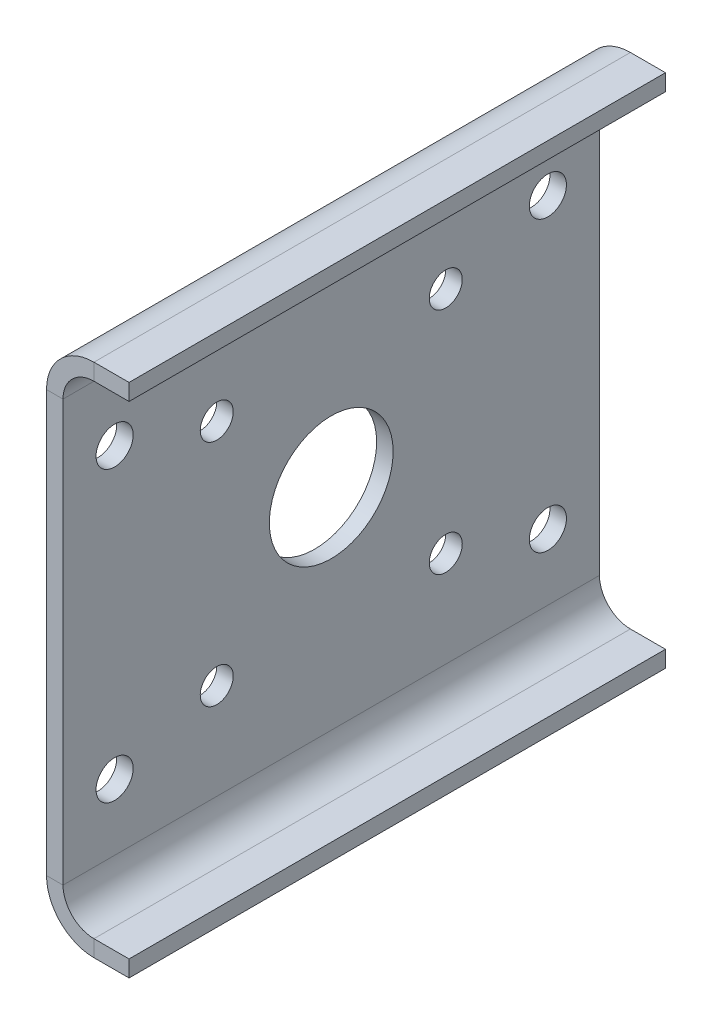
ISO-10303-21;
HEADER;
FILE_DESCRIPTION(('STEP AP214'),'2;1');
FILE_NAME('part.step','',(''),(''),'','','');
FILE_SCHEMA(('AUTOMOTIVE_DESIGN { 1 0 10303 214 1 1 1 1 }'));
ENDSEC;
DATA;
#1=APPLICATION_CONTEXT('core data for automotive mechanical design processes');
#2=APPLICATION_PROTOCOL_DEFINITION('international standard','automotive_design',2000,#1);
#3=PRODUCT_CONTEXT('',#1,'mechanical');
#4=PRODUCT('Part','Part','',(#3));
#5=PRODUCT_RELATED_PRODUCT_CATEGORY('part','',(#4));
#6=PRODUCT_DEFINITION_FORMATION('','',#4);
#7=PRODUCT_DEFINITION_CONTEXT('part definition',#1,'design');
#8=PRODUCT_DEFINITION('design','',#6,#7);
#9=PRODUCT_DEFINITION_SHAPE('','',#8);
#10=(LENGTH_UNIT() NAMED_UNIT(*) SI_UNIT(.MILLI.,.METRE.));
#11=(NAMED_UNIT(*) PLANE_ANGLE_UNIT() SI_UNIT($,.RADIAN.));
#12=(NAMED_UNIT(*) SI_UNIT($,.STERADIAN.) SOLID_ANGLE_UNIT());
#13=UNCERTAINTY_MEASURE_WITH_UNIT(LENGTH_MEASURE(1.E-05),#10,'distance_accuracy_value','');
#14=(GEOMETRIC_REPRESENTATION_CONTEXT(3) GLOBAL_UNCERTAINTY_ASSIGNED_CONTEXT((#13)) GLOBAL_UNIT_ASSIGNED_CONTEXT((#10,
#11,#12)) REPRESENTATION_CONTEXT('',''));
#15=CARTESIAN_POINT('',(0.,0.,0.));
#16=DIRECTION('',(0.,0.,1.));
#17=DIRECTION('',(1.,0.,0.));
#18=AXIS2_PLACEMENT_3D('',#15,#16,#17);
#19=CARTESIAN_POINT('',(-8.00000000000001,0.,0.));
#20=DIRECTION('',(1.00000000000001,0.,0.));
#21=DIRECTION('',(0.,0.,-1.));
#22=AXIS2_PLACEMENT_3D('',#19,#20,#21);
#23=PLANE('',#22);
#24=CARTESIAN_POINT('',(-7.99999999999756,-55.5,-55.4999999999999));
#25=DIRECTION('',(-1.00000000000001,0.,0.));
#26=DIRECTION('',(0.,0.,-1.));
#27=AXIS2_PLACEMENT_3D('',#24,#25,#26);
#28=CIRCLE('',#27,7.99999999999999);
#29=CARTESIAN_POINT('',(-7.99999999999756,-55.5,-63.4999999999999));
#30=VERTEX_POINT('',#29);
#31=EDGE_CURVE('E310',#30,#30,#28,.T.);
#32=ORIENTED_EDGE('',*,*,#31,.F.);
#33=EDGE_LOOP('',(#32));
#34=FACE_BOUND('',#33,.T.);
#35=CARTESIAN_POINT('',(-8.00000000000001,55.5000000000017,-55.4999999999994));
#36=DIRECTION('',(-1.00000000000001,0.,0.));
#37=DIRECTION('',(0.,1.00000000000001,0.));
#38=AXIS2_PLACEMENT_3D('',#35,#36,#37);
#39=CIRCLE('',#38,7.99999999999999);
#40=CARTESIAN_POINT('',(-8.00000000000002,63.5000000000018,-55.4999999999993));
#41=VERTEX_POINT('',#40);
#42=EDGE_CURVE('E315',#41,#41,#39,.T.);
#43=ORIENTED_EDGE('',*,*,#42,.F.);
#44=EDGE_LOOP('',(#43));
#45=FACE_BOUND('',#44,.T.);
#46=CARTESIAN_POINT('',(-7.99999999999756,-55.5000000000002,55.4999999999998));
#47=DIRECTION('',(-1.00000000000001,0.,0.));
#48=DIRECTION('',(0.,-1.00000000000001,0.));
#49=AXIS2_PLACEMENT_3D('',#46,#47,#48);
#50=CIRCLE('',#49,7.99999999999999);
#51=CARTESIAN_POINT('',(-7.99999999999756,-63.5000000000002,55.4999999999998));
#52=VERTEX_POINT('',#51);
#53=EDGE_CURVE('E307',#52,#52,#50,.T.);
#54=ORIENTED_EDGE('',*,*,#53,.F.);
#55=EDGE_LOOP('',(#54));
#56=FACE_BOUND('',#55,.T.);
#57=CARTESIAN_POINT('',(-8.00000000000001,55.5000000000012,55.4999999999999));
#58=DIRECTION('',(-1.00000000000001,0.,0.));
#59=DIRECTION('',(0.,0.,1.));
#60=AXIS2_PLACEMENT_3D('',#57,#58,#59);
#61=CIRCLE('',#60,7.99999999999999);
#62=CARTESIAN_POINT('',(-8.00000000000001,55.5000000000012,63.4999999999999));
#63=VERTEX_POINT('',#62);
#64=EDGE_CURVE('E304',#63,#63,#61,.T.);
#65=ORIENTED_EDGE('',*,*,#64,.F.);
#66=EDGE_LOOP('',(#65));
#67=FACE_BOUND('',#66,.T.);
#68=CARTESIAN_POINT('',(-7.99999999999756,70.0000000000012,-104.999999999995));
#69=DIRECTION('',(1.00000000000001,0.,0.));
#70=DIRECTION('',(0.,0.,-1.));
#71=AXIS2_PLACEMENT_3D('',#68,#69,#70);
#72=CIRCLE('',#71,8.99999999998515);
#73=CARTESIAN_POINT('',(-7.99999999999756,70.0000000000012,-113.999999999981));
#74=VERTEX_POINT('',#73);
#75=EDGE_CURVE('E328',#74,#74,#72,.F.);
#76=ORIENTED_EDGE('',*,*,#75,.F.);
#77=EDGE_LOOP('',(#76));
#78=FACE_BOUND('',#77,.T.);
#79=CARTESIAN_POINT('',(-8.00000000000001,-70.,-104.999999999996));
#80=DIRECTION('',(1.00000000000001,0.,0.));
#81=DIRECTION('',(0.,0.,-1.));
#82=AXIS2_PLACEMENT_3D('',#79,#80,#81);
#83=CIRCLE('',#82,8.99999999999579);
#84=CARTESIAN_POINT('',(-8.00000000000001,-70.,-113.999999999991));
#85=VERTEX_POINT('',#84);
#86=EDGE_CURVE('E334',#85,#85,#83,.F.);
#87=ORIENTED_EDGE('',*,*,#86,.F.);
#88=EDGE_LOOP('',(#87));
#89=FACE_BOUND('',#88,.T.);
#90=CARTESIAN_POINT('',(-7.99999999999756,70.0000000000012,104.999999999996));
#91=DIRECTION('',(1.00000000000001,0.,0.));
#92=DIRECTION('',(0.,0.,-1.));
#93=AXIS2_PLACEMENT_3D('',#90,#91,#92);
#94=CIRCLE('',#93,8.99999999998515);
#95=CARTESIAN_POINT('',(-7.99999999999756,70.0000000000012,96.0000000000108));
#96=VERTEX_POINT('',#95);
#97=EDGE_CURVE('E340',#96,#96,#94,.T.);
#98=ORIENTED_EDGE('',*,*,#97,.T.);
#99=EDGE_LOOP('',(#98));
#100=FACE_BOUND('',#99,.T.);
#101=CARTESIAN_POINT('',(-8.00000000000001,-70.,104.999999999996));
#102=DIRECTION('',(1.00000000000001,0.,0.));
#103=DIRECTION('',(0.,0.,-1.));
#104=AXIS2_PLACEMENT_3D('',#101,#102,#103);
#105=CIRCLE('',#104,8.99999999999579);
#106=CARTESIAN_POINT('',(-8.00000000000001,-70.,95.9999999999999));
#107=VERTEX_POINT('',#106);
#108=EDGE_CURVE('E213',#107,#107,#105,.T.);
#109=ORIENTED_EDGE('',*,*,#108,.T.);
#110=EDGE_LOOP('',(#109));
#111=FACE_BOUND('',#110,.T.);
#112=CARTESIAN_POINT('',(-8.00000000000001,0.,0.));
#113=DIRECTION('',(1.00000000000001,0.,0.));
#114=DIRECTION('',(0.,0.,-1.));
#115=AXIS2_PLACEMENT_3D('',#112,#113,#114);
#116=CIRCLE('',#115,30.);
#117=CARTESIAN_POINT('',(-8.00000000000001,0.,-30.));
#118=VERTEX_POINT('',#117);
#119=EDGE_CURVE('E291',#118,#118,#116,.T.);
#120=ORIENTED_EDGE('',*,*,#119,.T.);
#121=EDGE_LOOP('',(#120));
#122=FACE_BOUND('',#121,.T.);
#123=DIRECTION('',(0.,0.,-1.));
#124=VECTOR('',#123,1.);
#125=CARTESIAN_POINT('',(-8.00000000000001,-102.000000000001,-130.));
#126=LINE('',#125,#124);
#127=CARTESIAN_POINT('',(-8.00000000000001,-102.000000000001,-130.));
#128=VERTEX_POINT('',#127);
#129=CARTESIAN_POINT('',(-8.00000000000001,-102.000000000001,130.));
#130=VERTEX_POINT('',#129);
#131=EDGE_CURVE('E214',#128,#130,#126,.F.);
#132=ORIENTED_EDGE('',*,*,#131,.T.);
#133=DIRECTION('',(0.,-1.00000000000001,0.));
#134=VECTOR('',#133,1.);
#135=CARTESIAN_POINT('',(-8.00000000000001,-125.000000000001,130.));
#136=LINE('',#135,#134);
#137=CARTESIAN_POINT('',(-7.99999999999756,102.000000000002,130.));
#138=VERTEX_POINT('',#137);
#139=EDGE_CURVE('E87',#138,#130,#136,.T.);
#140=ORIENTED_EDGE('',*,*,#139,.F.);
#141=DIRECTION('',(0.,0.,1.));
#142=VECTOR('',#141,1.);
#143=CARTESIAN_POINT('',(-7.99999999999756,102.000000000002,130.));
#144=LINE('',#143,#142);
#145=CARTESIAN_POINT('',(-7.99999999999756,102.000000000002,-130.));
#146=VERTEX_POINT('',#145);
#147=EDGE_CURVE('E268',#138,#146,#144,.F.);
#148=ORIENTED_EDGE('',*,*,#147,.T.);
#149=DIRECTION('',(0.,1.00000000000001,0.));
#150=VECTOR('',#149,1.);
#151=CARTESIAN_POINT('',(-8.00000000000001,-125.000000000001,-130.));
#152=LINE('',#151,#150);
#153=EDGE_CURVE('E13',#128,#146,#152,.T.);
#154=ORIENTED_EDGE('',*,*,#153,.F.);
#155=EDGE_LOOP('',(#132,#140,#148,#154));
#156=FACE_BOUND('',#155,.T.);
#157=ADVANCED_FACE('F78',(#34,#45,#56,#67,#78,#89,#100,#111,#122,#156),#23,.F.);
#158=CARTESIAN_POINT('',(0.,0.,0.));
#159=DIRECTION('',(1.00000000000001,0.,0.));
#160=DIRECTION('',(0.,0.,-1.));
#161=AXIS2_PLACEMENT_3D('',#158,#159,#160);
#162=PLANE('',#161);
#163=CARTESIAN_POINT('',(2.44249065417534E-12,-55.5,-55.4999999999999));
#164=DIRECTION('',(1.00000000000001,0.,0.));
#165=DIRECTION('',(0.,0.,-1.));
#166=AXIS2_PLACEMENT_3D('',#163,#164,#165);
#167=CIRCLE('',#166,7.99999999999999);
#168=CARTESIAN_POINT('',(2.44249065417534E-12,-55.5,-63.4999999999999));
#169=VERTEX_POINT('',#168);
#170=EDGE_CURVE('E82',#169,#169,#167,.T.);
#171=ORIENTED_EDGE('',*,*,#170,.F.);
#172=EDGE_LOOP('',(#171));
#173=FACE_BOUND('',#172,.T.);
#174=CARTESIAN_POINT('',(0.,55.5000000000017,-55.4999999999994));
#175=DIRECTION('',(1.00000000000001,0.,0.));
#176=DIRECTION('',(0.,0.,-1.));
#177=AXIS2_PLACEMENT_3D('',#174,#175,#176);
#178=CIRCLE('',#177,7.99999999999999);
#179=CARTESIAN_POINT('',(0.,55.5000000000017,-63.4999999999994));
#180=VERTEX_POINT('',#179);
#181=EDGE_CURVE('E308',#180,#180,#178,.T.);
#182=ORIENTED_EDGE('',*,*,#181,.F.);
#183=EDGE_LOOP('',(#182));
#184=FACE_BOUND('',#183,.T.);
#185=CARTESIAN_POINT('',(2.44249065417534E-12,-55.5000000000002,55.4999999999998));
#186=DIRECTION('',(1.00000000000001,0.,0.));
#187=DIRECTION('',(0.,0.,-1.));
#188=AXIS2_PLACEMENT_3D('',#185,#186,#187);
#189=CIRCLE('',#188,7.99999999999999);
#190=CARTESIAN_POINT('',(2.44249065417534E-12,-55.5000000000002,47.4999999999998));
#191=VERTEX_POINT('',#190);
#192=EDGE_CURVE('E305',#191,#191,#189,.T.);
#193=ORIENTED_EDGE('',*,*,#192,.F.);
#194=EDGE_LOOP('',(#193));
#195=FACE_BOUND('',#194,.T.);
#196=CARTESIAN_POINT('',(0.,55.5000000000012,55.4999999999999));
#197=DIRECTION('',(1.00000000000001,0.,0.));
#198=DIRECTION('',(0.,0.,-1.));
#199=AXIS2_PLACEMENT_3D('',#196,#197,#198);
#200=CIRCLE('',#199,7.99999999999999);
#201=CARTESIAN_POINT('',(0.,55.5000000000012,47.5));
#202=VERTEX_POINT('',#201);
#203=EDGE_CURVE('E300',#202,#202,#200,.T.);
#204=ORIENTED_EDGE('',*,*,#203,.F.);
#205=EDGE_LOOP('',(#204));
#206=FACE_BOUND('',#205,.T.);
#207=CARTESIAN_POINT('',(2.44249065417534E-12,70.0000000000012,-104.999999999995));
#208=DIRECTION('',(-1.00000000000001,0.,0.));
#209=DIRECTION('',(0.,0.,1.));
#210=AXIS2_PLACEMENT_3D('',#207,#208,#209);
#211=CIRCLE('',#210,8.99999999998515);
#212=CARTESIAN_POINT('',(2.44249065417534E-12,70.0000000000012,-96.0000000000102));
#213=VERTEX_POINT('',#212);
#214=EDGE_CURVE('E303',#213,#213,#211,.T.);
#215=ORIENTED_EDGE('',*,*,#214,.T.);
#216=EDGE_LOOP('',(#215));
#217=FACE_BOUND('',#216,.T.);
#218=CARTESIAN_POINT('',(0.,-70.,-104.999999999996));
#219=DIRECTION('',(-1.00000000000001,0.,0.));
#220=DIRECTION('',(0.,0.,1.));
#221=AXIS2_PLACEMENT_3D('',#218,#219,#220);
#222=CIRCLE('',#221,8.99999999999579);
#223=CARTESIAN_POINT('',(0.,-70.,-95.9999999999999));
#224=VERTEX_POINT('',#223);
#225=EDGE_CURVE('E331',#224,#224,#222,.T.);
#226=ORIENTED_EDGE('',*,*,#225,.T.);
#227=EDGE_LOOP('',(#226));
#228=FACE_BOUND('',#227,.T.);
#229=CARTESIAN_POINT('',(2.44249065417534E-12,70.0000000000012,104.999999999996));
#230=DIRECTION('',(1.00000000000001,0.,0.));
#231=DIRECTION('',(0.,0.,-1.));
#232=AXIS2_PLACEMENT_3D('',#229,#230,#231);
#233=CIRCLE('',#232,8.99999999998515);
#234=CARTESIAN_POINT('',(2.44249065417534E-12,70.0000000000012,96.0000000000108));
#235=VERTEX_POINT('',#234);
#236=EDGE_CURVE('E337',#235,#235,#233,.T.);
#237=ORIENTED_EDGE('',*,*,#236,.F.);
#238=EDGE_LOOP('',(#237));
#239=FACE_BOUND('',#238,.T.);
#240=CARTESIAN_POINT('',(0.,-70.,104.999999999996));
#241=DIRECTION('',(1.00000000000001,0.,0.));
#242=DIRECTION('',(0.,0.,-1.));
#243=AXIS2_PLACEMENT_3D('',#240,#241,#242);
#244=CIRCLE('',#243,8.99999999999579);
#245=CARTESIAN_POINT('',(0.,-70.,95.9999999999999));
#246=VERTEX_POINT('',#245);
#247=EDGE_CURVE('E343',#246,#246,#244,.T.);
#248=ORIENTED_EDGE('',*,*,#247,.F.);
#249=EDGE_LOOP('',(#248));
#250=FACE_BOUND('',#249,.T.);
#251=CARTESIAN_POINT('',(0.,0.,0.));
#252=DIRECTION('',(1.00000000000001,0.,0.));
#253=DIRECTION('',(0.,0.,-1.));
#254=AXIS2_PLACEMENT_3D('',#251,#252,#253);
#255=CIRCLE('',#254,30.);
#256=CARTESIAN_POINT('',(0.,0.,-30.));
#257=VERTEX_POINT('',#256);
#258=EDGE_CURVE('E286',#257,#257,#255,.T.);
#259=ORIENTED_EDGE('',*,*,#258,.F.);
#260=EDGE_LOOP('',(#259));
#261=FACE_BOUND('',#260,.T.);
#262=DIRECTION('',(0.,-1.00000000000001,0.));
#263=VECTOR('',#262,1.);
#264=CARTESIAN_POINT('',(0.,-125.000000000001,130.));
#265=LINE('',#264,#263);
#266=CARTESIAN_POINT('',(2.44249065417534E-12,102.000000000001,130.));
#267=VERTEX_POINT('',#266);
#268=CARTESIAN_POINT('',(0.,-102.000000000001,130.));
#269=VERTEX_POINT('',#268);
#270=EDGE_CURVE('E294',#267,#269,#265,.T.);
#271=ORIENTED_EDGE('',*,*,#270,.T.);
#272=DIRECTION('',(0.,0.,-1.));
#273=VECTOR('',#272,1.);
#274=CARTESIAN_POINT('',(0.,-102.000000000001,-130.));
#275=LINE('',#274,#273);
#276=CARTESIAN_POINT('',(0.,-102.000000000001,-130.));
#277=VERTEX_POINT('',#276);
#278=EDGE_CURVE('E226',#277,#269,#275,.F.);
#279=ORIENTED_EDGE('',*,*,#278,.F.);
#280=DIRECTION('',(0.,1.00000000000001,0.));
#281=VECTOR('',#280,1.);
#282=CARTESIAN_POINT('',(0.,-125.000000000001,-130.));
#283=LINE('',#282,#281);
#284=CARTESIAN_POINT('',(2.44249065417534E-12,102.000000000001,-130.));
#285=VERTEX_POINT('',#284);
#286=EDGE_CURVE('E296',#277,#285,#283,.T.);
#287=ORIENTED_EDGE('',*,*,#286,.T.);
#288=DIRECTION('',(0.,0.,1.));
#289=VECTOR('',#288,1.);
#290=CARTESIAN_POINT('',(2.44249065417534E-12,102.000000000001,130.));
#291=LINE('',#290,#289);
#292=EDGE_CURVE('E95',#267,#285,#291,.F.);
#293=ORIENTED_EDGE('',*,*,#292,.F.);
#294=EDGE_LOOP('',(#271,#279,#287,#293));
#295=FACE_BOUND('',#294,.T.);
#296=ADVANCED_FACE('F385',(#173,#184,#195,#206,#217,#228,#239,#250,#261,#295),#162,.T.);
#297=CARTESIAN_POINT('',(-8.00000000000001,-125.000000000001,-130.));
#298=DIRECTION('',(0.,0.,-1.));
#299=DIRECTION('',(0.,1.00000000000001,0.));
#300=AXIS2_PLACEMENT_3D('',#297,#298,#299);
#301=PLANE('',#300);
#302=ORIENTED_EDGE('',*,*,#286,.F.);
#303=DIRECTION('',(-1.00000000000001,0.,0.));
#304=VECTOR('',#303,1.);
#305=CARTESIAN_POINT('',(0.,-102.000000000001,-130.));
#306=LINE('',#305,#304);
#307=EDGE_CURVE('E220',#277,#128,#306,.T.);
#308=ORIENTED_EDGE('',*,*,#307,.T.);
#309=ORIENTED_EDGE('',*,*,#153,.T.);
#310=DIRECTION('',(-1.00000000000001,0.,0.));
#311=VECTOR('',#310,1.);
#312=CARTESIAN_POINT('',(2.44249065417534E-12,102.000000000001,-130.));
#313=LINE('',#312,#311);
#314=EDGE_CURVE('E283',#285,#146,#313,.T.);
#315=ORIENTED_EDGE('',*,*,#314,.F.);
#316=EDGE_LOOP('',(#302,#308,#309,#315));
#317=FACE_BOUND('',#316,.T.);
#318=ADVANCED_FACE('F362',(#317),#301,.T.);
#319=CARTESIAN_POINT('',(-8.00000000000001,-125.000000000001,130.));
#320=DIRECTION('',(0.,0.,1.));
#321=DIRECTION('',(1.00000000000001,0.,0.));
#322=AXIS2_PLACEMENT_3D('',#319,#320,#321);
#323=PLANE('',#322);
#324=DIRECTION('',(-1.00000000000001,0.,0.));
#325=VECTOR('',#324,1.);
#326=CARTESIAN_POINT('',(0.,-102.000000000001,130.));
#327=LINE('',#326,#325);
#328=EDGE_CURVE('E231',#269,#130,#327,.T.);
#329=ORIENTED_EDGE('',*,*,#328,.F.);
#330=ORIENTED_EDGE('',*,*,#270,.F.);
#331=DIRECTION('',(-1.00000000000001,0.,0.));
#332=VECTOR('',#331,1.);
#333=CARTESIAN_POINT('',(2.44249065417534E-12,102.000000000001,130.));
#334=LINE('',#333,#332);
#335=EDGE_CURVE('E274',#267,#138,#334,.T.);
#336=ORIENTED_EDGE('',*,*,#335,.T.);
#337=ORIENTED_EDGE('',*,*,#139,.T.);
#338=EDGE_LOOP('',(#329,#330,#336,#337));
#339=FACE_BOUND('',#338,.T.);
#340=ADVANCED_FACE('F80',(#339),#323,.T.);
#341=CARTESIAN_POINT('',(-10.,0.,0.));
#342=DIRECTION('',(1.00000000000001,0.,0.));
#343=DIRECTION('',(0.,0.,-1.));
#344=AXIS2_PLACEMENT_3D('',#341,#342,#343);
#345=CYLINDRICAL_SURFACE('',#344,30.);
#346=ORIENTED_EDGE('',*,*,#258,.T.);
#347=EDGE_LOOP('',(#346));
#348=FACE_BOUND('',#347,.T.);
#349=ORIENTED_EDGE('',*,*,#119,.F.);
#350=EDGE_LOOP('',(#349));
#351=FACE_BOUND('',#350,.T.);
#352=ADVANCED_FACE('F395',(#348,#351),#345,.F.);
#353=CARTESIAN_POINT('',(15.0000000000023,102.000000000001,-130.));
#354=DIRECTION('',(0.,0.,-1.));
#355=DIRECTION('',(-1.00000000000001,0.,0.));
#356=AXIS2_PLACEMENT_3D('',#353,#354,#355);
#357=PLANE('',#356);
#358=DIRECTION('',(0.,1.00000000000001,0.));
#359=VECTOR('',#358,1.);
#360=CARTESIAN_POINT('',(14.9999999999999,125.000000000001,-130.));
#361=LINE('',#360,#359);
#362=CARTESIAN_POINT('',(15.0000000000001,117.000000000001,-130.));
#363=VERTEX_POINT('',#362);
#364=CARTESIAN_POINT('',(14.9999999999999,125.000000000001,-130.));
#365=VERTEX_POINT('',#364);
#366=EDGE_CURVE('E234',#363,#365,#361,.T.);
#367=ORIENTED_EDGE('',*,*,#366,.F.);
#368=CARTESIAN_POINT('',(15.0000000000023,102.000000000001,-130.));
#369=DIRECTION('',(0.,0.,1.));
#370=DIRECTION('',(1.00000000000001,0.,0.));
#371=AXIS2_PLACEMENT_3D('',#368,#369,#370);
#372=CIRCLE('',#371,15.);
#373=EDGE_CURVE('E277',#285,#363,#372,.F.);
#374=ORIENTED_EDGE('',*,*,#373,.F.);
#375=ORIENTED_EDGE('',*,*,#314,.T.);
#376=CARTESIAN_POINT('',(15.0000000000023,102.000000000001,-130.));
#377=DIRECTION('',(0.,0.,1.));
#378=DIRECTION('',(1.00000000000001,0.,0.));
#379=AXIS2_PLACEMENT_3D('',#376,#377,#378);
#380=CIRCLE('',#379,23.);
#381=EDGE_CURVE('E270',#146,#365,#380,.F.);
#382=ORIENTED_EDGE('',*,*,#381,.T.);
#383=EDGE_LOOP('',(#367,#374,#375,#382));
#384=FACE_BOUND('',#383,.T.);
#385=ADVANCED_FACE('F404',(#384),#357,.T.);
#386=CARTESIAN_POINT('',(15.0000000000023,102.000000000001,130.));
#387=DIRECTION('',(0.,0.,-1.));
#388=DIRECTION('',(-1.00000000000001,0.,0.));
#389=AXIS2_PLACEMENT_3D('',#386,#387,#388);
#390=PLANE('',#389);
#391=CARTESIAN_POINT('',(15.0000000000023,102.000000000001,130.));
#392=DIRECTION('',(0.,0.,1.));
#393=DIRECTION('',(1.00000000000001,0.,0.));
#394=AXIS2_PLACEMENT_3D('',#391,#392,#393);
#395=CIRCLE('',#394,15.);
#396=CARTESIAN_POINT('',(14.9999999999999,117.000000000001,130.));
#397=VERTEX_POINT('',#396);
#398=EDGE_CURVE('E238',#397,#267,#395,.T.);
#399=ORIENTED_EDGE('',*,*,#398,.F.);
#400=DIRECTION('',(0.,1.00000000000001,0.));
#401=VECTOR('',#400,1.);
#402=CARTESIAN_POINT('',(14.9999999999999,117.000000000001,130.));
#403=LINE('',#402,#401);
#404=CARTESIAN_POINT('',(14.9999999999999,125.000000000001,130.));
#405=VERTEX_POINT('',#404);
#406=EDGE_CURVE('E261',#397,#405,#403,.T.);
#407=ORIENTED_EDGE('',*,*,#406,.T.);
#408=CARTESIAN_POINT('',(15.0000000000023,102.000000000001,130.));
#409=DIRECTION('',(0.,0.,1.));
#410=DIRECTION('',(1.00000000000001,0.,0.));
#411=AXIS2_PLACEMENT_3D('',#408,#409,#410);
#412=CIRCLE('',#411,23.);
#413=EDGE_CURVE('E271',#405,#138,#412,.T.);
#414=ORIENTED_EDGE('',*,*,#413,.T.);
#415=ORIENTED_EDGE('',*,*,#335,.F.);
#416=EDGE_LOOP('',(#399,#407,#414,#415));
#417=FACE_BOUND('',#416,.T.);
#418=ADVANCED_FACE('F409',(#417),#390,.F.);
#419=CARTESIAN_POINT('',(15.0000000000023,102.000000000001,130.));
#420=DIRECTION('',(0.,0.,1.));
#421=DIRECTION('',(0.,1.00000000000001,0.));
#422=AXIS2_PLACEMENT_3D('',#419,#420,#421);
#423=CYLINDRICAL_SURFACE('',#422,23.);
#424=ORIENTED_EDGE('',*,*,#147,.F.);
#425=ORIENTED_EDGE('',*,*,#413,.F.);
#426=DIRECTION('',(0.,0.,1.));
#427=VECTOR('',#426,1.);
#428=CARTESIAN_POINT('',(14.9999999999999,125.000000000001,0.));
#429=LINE('',#428,#427);
#430=EDGE_CURVE('E258',#365,#405,#429,.T.);
#431=ORIENTED_EDGE('',*,*,#430,.F.);
#432=ORIENTED_EDGE('',*,*,#381,.F.);
#433=EDGE_LOOP('',(#424,#425,#431,#432));
#434=FACE_BOUND('',#433,.T.);
#435=ADVANCED_FACE('F440',(#434),#423,.T.);
#436=CARTESIAN_POINT('',(15.0000000000023,102.000000000001,130.));
#437=DIRECTION('',(0.,0.,1.));
#438=DIRECTION('',(0.,1.00000000000001,0.));
#439=AXIS2_PLACEMENT_3D('',#436,#437,#438);
#440=CYLINDRICAL_SURFACE('',#439,15.);
#441=ORIENTED_EDGE('',*,*,#292,.T.);
#442=ORIENTED_EDGE('',*,*,#373,.T.);
#443=DIRECTION('',(0.,0.,-1.));
#444=VECTOR('',#443,1.);
#445=CARTESIAN_POINT('',(15.0000000000001,117.000000000001,-130.));
#446=LINE('',#445,#444);
#447=EDGE_CURVE('E264',#363,#397,#446,.F.);
#448=ORIENTED_EDGE('',*,*,#447,.T.);
#449=ORIENTED_EDGE('',*,*,#398,.T.);
#450=EDGE_LOOP('',(#441,#442,#448,#449));
#451=FACE_BOUND('',#450,.T.);
#452=ADVANCED_FACE('F420',(#451),#440,.F.);
#453=CARTESIAN_POINT('',(0.,125.000000000001,130.));
#454=DIRECTION('',(0.,0.,1.));
#455=DIRECTION('',(0.,-1.00000000000001,0.));
#456=AXIS2_PLACEMENT_3D('',#453,#454,#455);
#457=PLANE('',#456);
#458=DIRECTION('',(-1.00000000000001,0.,0.));
#459=VECTOR('',#458,1.);
#460=CARTESIAN_POINT('',(0.,125.000000000001,130.));
#461=LINE('',#460,#459);
#462=CARTESIAN_POINT('',(32.,125.000000000001,130.));
#463=VERTEX_POINT('',#462);
#464=EDGE_CURVE('E242',#463,#405,#461,.T.);
#465=ORIENTED_EDGE('',*,*,#464,.T.);
#466=ORIENTED_EDGE('',*,*,#406,.F.);
#467=DIRECTION('',(1.00000000000001,0.,0.));
#468=VECTOR('',#467,1.);
#469=CARTESIAN_POINT('',(-4.44089209850063E-13,117.000000000001,130.));
#470=LINE('',#469,#468);
#471=CARTESIAN_POINT('',(32.,117.000000000001,130.));
#472=VERTEX_POINT('',#471);
#473=EDGE_CURVE('E250',#472,#397,#470,.F.);
#474=ORIENTED_EDGE('',*,*,#473,.F.);
#475=DIRECTION('',(0.,-1.00000000000001,0.));
#476=VECTOR('',#475,1.);
#477=CARTESIAN_POINT('',(32.,125.000000000001,130.));
#478=LINE('',#477,#476);
#479=EDGE_CURVE('E236',#463,#472,#478,.T.);
#480=ORIENTED_EDGE('',*,*,#479,.F.);
#481=EDGE_LOOP('',(#465,#466,#474,#480));
#482=FACE_BOUND('',#481,.T.);
#483=ADVANCED_FACE('F434',(#482),#457,.T.);
#484=CARTESIAN_POINT('',(32.,125.000000000001,-130.));
#485=DIRECTION('',(0.,0.,-1.));
#486=DIRECTION('',(0.,1.00000000000001,0.));
#487=AXIS2_PLACEMENT_3D('',#484,#485,#486);
#488=PLANE('',#487);
#489=DIRECTION('',(-1.00000000000001,0.,0.));
#490=VECTOR('',#489,1.);
#491=CARTESIAN_POINT('',(-4.44089209850063E-13,117.000000000001,-130.));
#492=LINE('',#491,#490);
#493=CARTESIAN_POINT('',(32.,117.000000000001,-130.));
#494=VERTEX_POINT('',#493);
#495=EDGE_CURVE('E256',#363,#494,#492,.F.);
#496=ORIENTED_EDGE('',*,*,#495,.F.);
#497=ORIENTED_EDGE('',*,*,#366,.T.);
#498=DIRECTION('',(1.00000000000001,0.,0.));
#499=VECTOR('',#498,1.);
#500=CARTESIAN_POINT('',(32.,125.000000000001,-130.));
#501=LINE('',#500,#499);
#502=CARTESIAN_POINT('',(32.,125.000000000001,-130.));
#503=VERTEX_POINT('',#502);
#504=EDGE_CURVE('E248',#365,#503,#501,.T.);
#505=ORIENTED_EDGE('',*,*,#504,.T.);
#506=DIRECTION('',(0.,-1.00000000000001,0.));
#507=VECTOR('',#506,1.);
#508=CARTESIAN_POINT('',(32.,125.000000000001,-130.));
#509=LINE('',#508,#507);
#510=EDGE_CURVE('E239',#503,#494,#509,.T.);
#511=ORIENTED_EDGE('',*,*,#510,.T.);
#512=EDGE_LOOP('',(#496,#497,#505,#511));
#513=FACE_BOUND('',#512,.T.);
#514=ADVANCED_FACE('F428',(#513),#488,.T.);
#515=CARTESIAN_POINT('',(-4.44089209850063E-13,125.000000000001,0.));
#516=DIRECTION('',(0.,1.00000000000001,0.));
#517=DIRECTION('',(-1.00000000000001,0.,0.));
#518=AXIS2_PLACEMENT_3D('',#515,#516,#517);
#519=PLANE('',#518);
#520=ORIENTED_EDGE('',*,*,#504,.F.);
#521=ORIENTED_EDGE('',*,*,#430,.T.);
#522=ORIENTED_EDGE('',*,*,#464,.F.);
#523=DIRECTION('',(0.,0.,1.));
#524=VECTOR('',#523,1.);
#525=CARTESIAN_POINT('',(32.,125.000000000001,130.));
#526=LINE('',#525,#524);
#527=EDGE_CURVE('E245',#503,#463,#526,.T.);
#528=ORIENTED_EDGE('',*,*,#527,.F.);
#529=EDGE_LOOP('',(#520,#521,#522,#528));
#530=FACE_BOUND('',#529,.T.);
#531=ADVANCED_FACE('F437',(#530),#519,.T.);
#532=CARTESIAN_POINT('',(-4.44089209850063E-13,117.000000000001,0.));
#533=DIRECTION('',(0.,1.00000000000001,0.));
#534=DIRECTION('',(-1.00000000000001,0.,0.));
#535=AXIS2_PLACEMENT_3D('',#532,#533,#534);
#536=PLANE('',#535);
#537=ORIENTED_EDGE('',*,*,#447,.F.);
#538=ORIENTED_EDGE('',*,*,#495,.T.);
#539=DIRECTION('',(0.,0.,-1.));
#540=VECTOR('',#539,1.);
#541=CARTESIAN_POINT('',(32.,117.000000000001,0.));
#542=LINE('',#541,#540);
#543=EDGE_CURVE('E253',#494,#472,#542,.F.);
#544=ORIENTED_EDGE('',*,*,#543,.T.);
#545=ORIENTED_EDGE('',*,*,#473,.T.);
#546=EDGE_LOOP('',(#537,#538,#544,#545));
#547=FACE_BOUND('',#546,.T.);
#548=ADVANCED_FACE('F380',(#547),#536,.F.);
#549=CARTESIAN_POINT('',(32.,125.000000000001,130.));
#550=DIRECTION('',(1.00000000000001,0.,0.));
#551=DIRECTION('',(0.,1.00000000000001,0.));
#552=AXIS2_PLACEMENT_3D('',#549,#550,#551);
#553=PLANE('',#552);
#554=ORIENTED_EDGE('',*,*,#543,.F.);
#555=ORIENTED_EDGE('',*,*,#510,.F.);
#556=ORIENTED_EDGE('',*,*,#527,.T.);
#557=ORIENTED_EDGE('',*,*,#479,.T.);
#558=EDGE_LOOP('',(#554,#555,#556,#557));
#559=FACE_BOUND('',#558,.T.);
#560=ADVANCED_FACE('F373',(#559),#553,.T.);
#561=CARTESIAN_POINT('',(15.0000000000001,-102.000000000001,130.));
#562=DIRECTION('',(0.,0.,1.));
#563=DIRECTION('',(1.00000000000001,0.,0.));
#564=AXIS2_PLACEMENT_3D('',#561,#562,#563);
#565=PLANE('',#564);
#566=DIRECTION('',(0.,-1.00000000000001,0.));
#567=VECTOR('',#566,1.);
#568=CARTESIAN_POINT('',(14.9999999999999,-125.000000000001,130.));
#569=LINE('',#568,#567);
#570=CARTESIAN_POINT('',(15.0000000000023,-117.000000000001,130.));
#571=VERTEX_POINT('',#570);
#572=CARTESIAN_POINT('',(14.9999999999999,-125.000000000001,130.));
#573=VERTEX_POINT('',#572);
#574=EDGE_CURVE('E210',#571,#573,#569,.T.);
#575=ORIENTED_EDGE('',*,*,#574,.F.);
#576=CARTESIAN_POINT('',(15.0000000000001,-102.000000000001,130.));
#577=DIRECTION('',(0.,0.,-1.));
#578=DIRECTION('',(-1.00000000000001,0.,0.));
#579=AXIS2_PLACEMENT_3D('',#576,#577,#578);
#580=CIRCLE('',#579,15.);
#581=EDGE_CURVE('E223',#269,#571,#580,.F.);
#582=ORIENTED_EDGE('',*,*,#581,.F.);
#583=ORIENTED_EDGE('',*,*,#328,.T.);
#584=CARTESIAN_POINT('',(15.0000000000001,-102.000000000001,130.));
#585=DIRECTION('',(0.,0.,-1.));
#586=DIRECTION('',(-1.00000000000001,0.,0.));
#587=AXIS2_PLACEMENT_3D('',#584,#585,#586);
#588=CIRCLE('',#587,23.);
#589=EDGE_CURVE('E216',#130,#573,#588,.F.);
#590=ORIENTED_EDGE('',*,*,#589,.T.);
#591=EDGE_LOOP('',(#575,#582,#583,#590));
#592=FACE_BOUND('',#591,.T.);
#593=ADVANCED_FACE('F371',(#592),#565,.T.);
#594=CARTESIAN_POINT('',(15.0000000000001,-102.000000000001,-130.));
#595=DIRECTION('',(0.,0.,1.));
#596=DIRECTION('',(1.00000000000001,0.,0.));
#597=AXIS2_PLACEMENT_3D('',#594,#595,#596);
#598=PLANE('',#597);
#599=CARTESIAN_POINT('',(15.0000000000001,-102.000000000001,-130.));
#600=DIRECTION('',(0.,0.,-1.));
#601=DIRECTION('',(-1.00000000000001,0.,0.));
#602=AXIS2_PLACEMENT_3D('',#599,#600,#601);
#603=CIRCLE('',#602,15.);
#604=CARTESIAN_POINT('',(15.0000000000023,-117.000000000001,-130.));
#605=VERTEX_POINT('',#604);
#606=EDGE_CURVE('E180',#605,#277,#603,.T.);
#607=ORIENTED_EDGE('',*,*,#606,.F.);
#608=DIRECTION('',(0.,-1.00000000000001,0.));
#609=VECTOR('',#608,1.);
#610=CARTESIAN_POINT('',(15.0000000000023,-117.000000000001,-130.));
#611=LINE('',#610,#609);
#612=CARTESIAN_POINT('',(14.9999999999999,-125.000000000001,-130.));
#613=VERTEX_POINT('',#612);
#614=EDGE_CURVE('E205',#605,#613,#611,.T.);
#615=ORIENTED_EDGE('',*,*,#614,.T.);
#616=CARTESIAN_POINT('',(15.0000000000001,-102.000000000001,-130.));
#617=DIRECTION('',(0.,0.,-1.));
#618=DIRECTION('',(-1.00000000000001,0.,0.));
#619=AXIS2_PLACEMENT_3D('',#616,#617,#618);
#620=CIRCLE('',#619,23.);
#621=EDGE_CURVE('E217',#613,#128,#620,.T.);
#622=ORIENTED_EDGE('',*,*,#621,.T.);
#623=ORIENTED_EDGE('',*,*,#307,.F.);
#624=EDGE_LOOP('',(#607,#615,#622,#623));
#625=FACE_BOUND('',#624,.T.);
#626=ADVANCED_FACE('F359',(#625),#598,.F.);
#627=CARTESIAN_POINT('',(15.0000000000001,-102.000000000001,-130.));
#628=DIRECTION('',(0.,0.,-1.));
#629=DIRECTION('',(0.,-1.00000000000001,0.));
#630=AXIS2_PLACEMENT_3D('',#627,#628,#629);
#631=CYLINDRICAL_SURFACE('',#630,23.);
#632=ORIENTED_EDGE('',*,*,#131,.F.);
#633=ORIENTED_EDGE('',*,*,#621,.F.);
#634=DIRECTION('',(0.,0.,-1.));
#635=VECTOR('',#634,1.);
#636=CARTESIAN_POINT('',(14.9999999999999,-125.000000000001,130.));
#637=LINE('',#636,#635);
#638=EDGE_CURVE('E189',#613,#573,#637,.F.);
#639=ORIENTED_EDGE('',*,*,#638,.T.);
#640=ORIENTED_EDGE('',*,*,#589,.F.);
#641=EDGE_LOOP('',(#632,#633,#639,#640));
#642=FACE_BOUND('',#641,.T.);
#643=ADVANCED_FACE('F365',(#642),#631,.T.);
#644=CARTESIAN_POINT('',(15.0000000000001,-102.000000000001,-130.));
#645=DIRECTION('',(0.,0.,-1.));
#646=DIRECTION('',(0.,-1.00000000000001,0.));
#647=AXIS2_PLACEMENT_3D('',#644,#645,#646);
#648=CYLINDRICAL_SURFACE('',#647,15.);
#649=ORIENTED_EDGE('',*,*,#278,.T.);
#650=ORIENTED_EDGE('',*,*,#581,.T.);
#651=DIRECTION('',(0.,0.,-1.));
#652=VECTOR('',#651,1.);
#653=CARTESIAN_POINT('',(15.0000000000023,-117.000000000001,130.));
#654=LINE('',#653,#652);
#655=EDGE_CURVE('E208',#571,#605,#654,.T.);
#656=ORIENTED_EDGE('',*,*,#655,.T.);
#657=ORIENTED_EDGE('',*,*,#606,.T.);
#658=EDGE_LOOP('',(#649,#650,#656,#657));
#659=FACE_BOUND('',#658,.T.);
#660=ADVANCED_FACE('F355',(#659),#648,.F.);
#661=CARTESIAN_POINT('',(0.,-125.000000000001,130.));
#662=DIRECTION('',(0.,0.,1.));
#663=DIRECTION('',(0.,-1.00000000000001,0.));
#664=AXIS2_PLACEMENT_3D('',#661,#662,#663);
#665=PLANE('',#664);
#666=DIRECTION('',(1.00000000000001,0.,0.));
#667=VECTOR('',#666,1.);
#668=CARTESIAN_POINT('',(1.99840144432528E-12,-117.000000000001,130.));
#669=LINE('',#668,#667);
#670=CARTESIAN_POINT('',(32.0000000000025,-117.000000000001,130.));
#671=VERTEX_POINT('',#670);
#672=EDGE_CURVE('E202',#571,#671,#669,.T.);
#673=ORIENTED_EDGE('',*,*,#672,.F.);
#674=ORIENTED_EDGE('',*,*,#574,.T.);
#675=DIRECTION('',(-1.00000000000001,0.,0.));
#676=VECTOR('',#675,1.);
#677=CARTESIAN_POINT('',(0.,-125.000000000001,130.));
#678=LINE('',#677,#676);
#679=CARTESIAN_POINT('',(32.,-125.000000000001,130.));
#680=VERTEX_POINT('',#679);
#681=EDGE_CURVE('E194',#573,#680,#678,.F.);
#682=ORIENTED_EDGE('',*,*,#681,.T.);
#683=DIRECTION('',(0.,1.00000000000001,0.));
#684=VECTOR('',#683,1.);
#685=CARTESIAN_POINT('',(32.,-125.000000000001,130.));
#686=LINE('',#685,#684);
#687=EDGE_CURVE('E181',#680,#671,#686,.T.);
#688=ORIENTED_EDGE('',*,*,#687,.T.);
#689=EDGE_LOOP('',(#673,#674,#682,#688));
#690=FACE_BOUND('',#689,.T.);
#691=ADVANCED_FACE('F349',(#690),#665,.T.);
#692=CARTESIAN_POINT('',(32.,-125.000000000001,-130.));
#693=DIRECTION('',(0.,0.,-1.));
#694=DIRECTION('',(0.,1.00000000000001,0.));
#695=AXIS2_PLACEMENT_3D('',#692,#693,#694);
#696=PLANE('',#695);
#697=DIRECTION('',(1.00000000000001,0.,0.));
#698=VECTOR('',#697,1.);
#699=CARTESIAN_POINT('',(32.,-125.000000000001,-130.));
#700=LINE('',#699,#698);
#701=CARTESIAN_POINT('',(32.,-125.000000000001,-130.));
#702=VERTEX_POINT('',#701);
#703=EDGE_CURVE('E173',#702,#613,#700,.F.);
#704=ORIENTED_EDGE('',*,*,#703,.T.);
#705=ORIENTED_EDGE('',*,*,#614,.F.);
#706=DIRECTION('',(-1.00000000000001,0.,0.));
#707=VECTOR('',#706,1.);
#708=CARTESIAN_POINT('',(1.99840144432528E-12,-117.000000000001,-130.));
#709=LINE('',#708,#707);
#710=CARTESIAN_POINT('',(32.0000000000025,-117.000000000001,-130.));
#711=VERTEX_POINT('',#710);
#712=EDGE_CURVE('E175',#711,#605,#709,.T.);
#713=ORIENTED_EDGE('',*,*,#712,.F.);
#714=DIRECTION('',(0.,1.00000000000001,0.));
#715=VECTOR('',#714,1.);
#716=CARTESIAN_POINT('',(32.,-125.000000000001,-130.));
#717=LINE('',#716,#715);
#718=EDGE_CURVE('E169',#702,#711,#717,.T.);
#719=ORIENTED_EDGE('',*,*,#718,.F.);
#720=EDGE_LOOP('',(#704,#705,#713,#719));
#721=FACE_BOUND('',#720,.T.);
#722=ADVANCED_FACE('F171',(#721),#696,.T.);
#723=CARTESIAN_POINT('',(-4.44089209850063E-13,-125.000000000001,0.));
#724=DIRECTION('',(0.,1.00000000000001,0.));
#725=DIRECTION('',(-1.00000000000001,0.,0.));
#726=AXIS2_PLACEMENT_3D('',#723,#724,#725);
#727=PLANE('',#726);
#728=ORIENTED_EDGE('',*,*,#638,.F.);
#729=ORIENTED_EDGE('',*,*,#703,.F.);
#730=DIRECTION('',(0.,0.,1.));
#731=VECTOR('',#730,1.);
#732=CARTESIAN_POINT('',(32.,-125.000000000001,130.));
#733=LINE('',#732,#731);
#734=EDGE_CURVE('E188',#680,#702,#733,.F.);
#735=ORIENTED_EDGE('',*,*,#734,.F.);
#736=ORIENTED_EDGE('',*,*,#681,.F.);
#737=EDGE_LOOP('',(#728,#729,#735,#736));
#738=FACE_BOUND('',#737,.T.);
#739=ADVANCED_FACE('F186',(#738),#727,.F.);
#740=CARTESIAN_POINT('',(1.99840144432528E-12,-117.000000000001,0.));
#741=DIRECTION('',(0.,1.00000000000001,0.));
#742=DIRECTION('',(-1.00000000000001,0.,0.));
#743=AXIS2_PLACEMENT_3D('',#740,#741,#742);
#744=PLANE('',#743);
#745=ORIENTED_EDGE('',*,*,#712,.T.);
#746=ORIENTED_EDGE('',*,*,#655,.F.);
#747=ORIENTED_EDGE('',*,*,#672,.T.);
#748=DIRECTION('',(0.,0.,-1.));
#749=VECTOR('',#748,1.);
#750=CARTESIAN_POINT('',(32.0000000000025,-117.000000000001,0.));
#751=LINE('',#750,#749);
#752=EDGE_CURVE('E200',#671,#711,#751,.T.);
#753=ORIENTED_EDGE('',*,*,#752,.T.);
#754=EDGE_LOOP('',(#745,#746,#747,#753));
#755=FACE_BOUND('',#754,.T.);
#756=ADVANCED_FACE('F351',(#755),#744,.T.);
#757=CARTESIAN_POINT('',(32.,-125.000000000001,130.));
#758=DIRECTION('',(1.00000000000001,0.,0.));
#759=DIRECTION('',(0.,1.00000000000001,0.));
#760=AXIS2_PLACEMENT_3D('',#757,#758,#759);
#761=PLANE('',#760);
#762=ORIENTED_EDGE('',*,*,#752,.F.);
#763=ORIENTED_EDGE('',*,*,#687,.F.);
#764=ORIENTED_EDGE('',*,*,#734,.T.);
#765=ORIENTED_EDGE('',*,*,#718,.T.);
#766=EDGE_LOOP('',(#762,#763,#764,#765));
#767=FACE_BOUND('',#766,.T.);
#768=ADVANCED_FACE('F192',(#767),#761,.T.);
#769=CARTESIAN_POINT('',(-10.,-70.0000000000001,104.999999999996));
#770=DIRECTION('',(1.00000000000001,0.,0.));
#771=DIRECTION('',(0.,0.,-1.));
#772=AXIS2_PLACEMENT_3D('',#769,#770,#771);
#773=CYLINDRICAL_SURFACE('',#772,8.99999999999579);
#774=ORIENTED_EDGE('',*,*,#247,.T.);
#775=EDGE_LOOP('',(#774));
#776=FACE_BOUND('',#775,.T.);
#777=ORIENTED_EDGE('',*,*,#108,.F.);
#778=EDGE_LOOP('',(#777));
#779=FACE_BOUND('',#778,.T.);
#780=ADVANCED_FACE('F537',(#776,#779),#773,.F.);
#781=CARTESIAN_POINT('',(-9.99999999999757,70.0000000000012,104.999999999996));
#782=DIRECTION('',(1.00000000000001,0.,0.));
#783=DIRECTION('',(0.,0.,-1.));
#784=AXIS2_PLACEMENT_3D('',#781,#782,#783);
#785=CYLINDRICAL_SURFACE('',#784,8.99999999998515);
#786=ORIENTED_EDGE('',*,*,#236,.T.);
#787=EDGE_LOOP('',(#786));
#788=FACE_BOUND('',#787,.T.);
#789=ORIENTED_EDGE('',*,*,#97,.F.);
#790=EDGE_LOOP('',(#789));
#791=FACE_BOUND('',#790,.T.);
#792=ADVANCED_FACE('F546',(#788,#791),#785,.F.);
#793=CARTESIAN_POINT('',(-10.,-70.0000000000001,-104.999999999996));
#794=DIRECTION('',(1.00000000000001,0.,0.));
#795=DIRECTION('',(0.,0.,-1.));
#796=AXIS2_PLACEMENT_3D('',#793,#794,#795);
#797=CYLINDRICAL_SURFACE('',#796,8.99999999999579);
#798=ORIENTED_EDGE('',*,*,#225,.F.);
#799=EDGE_LOOP('',(#798));
#800=FACE_BOUND('',#799,.T.);
#801=ORIENTED_EDGE('',*,*,#86,.T.);
#802=EDGE_LOOP('',(#801));
#803=FACE_BOUND('',#802,.T.);
#804=ADVANCED_FACE('F556',(#800,#803),#797,.F.);
#805=CARTESIAN_POINT('',(-9.99999999999757,70.0000000000012,-104.999999999995));
#806=DIRECTION('',(1.00000000000001,0.,0.));
#807=DIRECTION('',(0.,0.,-1.));
#808=AXIS2_PLACEMENT_3D('',#805,#806,#807);
#809=CYLINDRICAL_SURFACE('',#808,8.99999999998515);
#810=ORIENTED_EDGE('',*,*,#214,.F.);
#811=EDGE_LOOP('',(#810));
#812=FACE_BOUND('',#811,.T.);
#813=ORIENTED_EDGE('',*,*,#75,.T.);
#814=EDGE_LOOP('',(#813));
#815=FACE_BOUND('',#814,.T.);
#816=ADVANCED_FACE('F566',(#812,#815),#809,.F.);
#817=CARTESIAN_POINT('',(2.,55.5000000000011,55.4999999999999));
#818=DIRECTION('',(-1.00000000000001,0.,0.));
#819=DIRECTION('',(0.,0.,1.));
#820=AXIS2_PLACEMENT_3D('',#817,#818,#819);
#821=CYLINDRICAL_SURFACE('',#820,7.99999999999999);
#822=ORIENTED_EDGE('',*,*,#203,.T.);
#823=EDGE_LOOP('',(#822));
#824=FACE_BOUND('',#823,.T.);
#825=ORIENTED_EDGE('',*,*,#64,.T.);
#826=EDGE_LOOP('',(#825));
#827=FACE_BOUND('',#826,.T.);
#828=ADVANCED_FACE('F576',(#824,#827),#821,.F.);
#829=CARTESIAN_POINT('',(2.00000000000244,-55.5000000000008,55.4999999999998));
#830=DIRECTION('',(-1.00000000000001,0.,0.));
#831=DIRECTION('',(0.,0.,1.));
#832=AXIS2_PLACEMENT_3D('',#829,#830,#831);
#833=CYLINDRICAL_SURFACE('',#832,7.99999999999999);
#834=ORIENTED_EDGE('',*,*,#192,.T.);
#835=EDGE_LOOP('',(#834));
#836=FACE_BOUND('',#835,.T.);
#837=ORIENTED_EDGE('',*,*,#53,.T.);
#838=EDGE_LOOP('',(#837));
#839=FACE_BOUND('',#838,.T.);
#840=ADVANCED_FACE('F586',(#836,#839),#833,.F.);
#841=CARTESIAN_POINT('',(2.,55.5000000000015,-55.4999999999994));
#842=DIRECTION('',(-1.00000000000001,0.,0.));
#843=DIRECTION('',(0.,0.,1.));
#844=AXIS2_PLACEMENT_3D('',#841,#842,#843);
#845=CYLINDRICAL_SURFACE('',#844,7.99999999999999);
#846=ORIENTED_EDGE('',*,*,#181,.T.);
#847=EDGE_LOOP('',(#846));
#848=FACE_BOUND('',#847,.T.);
#849=ORIENTED_EDGE('',*,*,#42,.T.);
#850=EDGE_LOOP('',(#849));
#851=FACE_BOUND('',#850,.T.);
#852=ADVANCED_FACE('F596',(#848,#851),#845,.F.);
#853=CARTESIAN_POINT('',(2.00000000000244,-55.5000000000006,-55.4999999999999));
#854=DIRECTION('',(-1.00000000000001,0.,0.));
#855=DIRECTION('',(0.,0.,1.));
#856=AXIS2_PLACEMENT_3D('',#853,#854,#855);
#857=CYLINDRICAL_SURFACE('',#856,7.99999999999999);
#858=ORIENTED_EDGE('',*,*,#170,.T.);
#859=EDGE_LOOP('',(#858));
#860=FACE_BOUND('',#859,.T.);
#861=ORIENTED_EDGE('',*,*,#31,.T.);
#862=EDGE_LOOP('',(#861));
#863=FACE_BOUND('',#862,.T.);
#864=ADVANCED_FACE('F606',(#860,#863),#857,.F.);
#865=CLOSED_SHELL('',(#157,#296,#318,#340,#352,#385,#418,#435,#452,#483,#514,#531,#548,#560,
#593,#626,#643,#660,#691,#722,#739,#756,#768,#780,#792,#804,#816,#828,#840,#852,#864));
#866=MANIFOLD_SOLID_BREP('B2',#865);
#867=ADVANCED_BREP_SHAPE_REPRESENTATION('',(#18,#866),#14);
#868=SHAPE_DEFINITION_REPRESENTATION(#9,#867);
ENDSEC;
END-ISO-10303-21;
